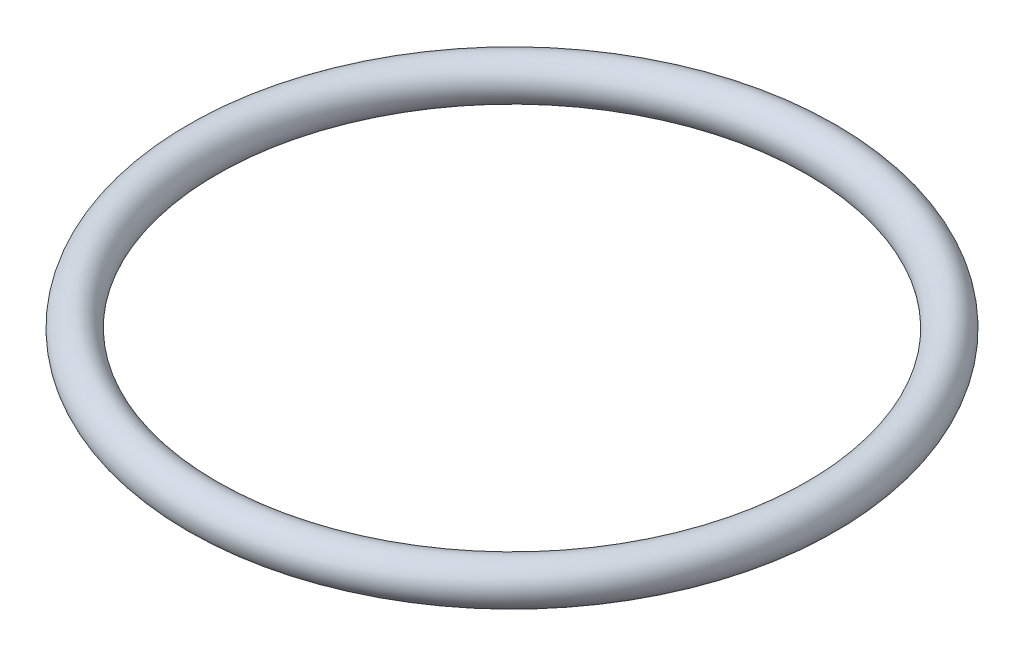
ISO-10303-21;
HEADER;
FILE_DESCRIPTION(('STEP AP214'),'2;1');
FILE_NAME('part.step','',(''),(''),'','','');
FILE_SCHEMA(('AUTOMOTIVE_DESIGN { 1 0 10303 214 1 1 1 1 }'));
ENDSEC;
DATA;
#1=APPLICATION_CONTEXT('core data for automotive mechanical design processes');
#2=APPLICATION_PROTOCOL_DEFINITION('international standard','automotive_design',2000,#1);
#3=PRODUCT_CONTEXT('',#1,'mechanical');
#4=PRODUCT('Part','Part','',(#3));
#5=PRODUCT_RELATED_PRODUCT_CATEGORY('part','',(#4));
#6=PRODUCT_DEFINITION_FORMATION('','',#4);
#7=PRODUCT_DEFINITION_CONTEXT('part definition',#1,'design');
#8=PRODUCT_DEFINITION('design','',#6,#7);
#9=PRODUCT_DEFINITION_SHAPE('','',#8);
#10=(LENGTH_UNIT() NAMED_UNIT(*) SI_UNIT(.MILLI.,.METRE.));
#11=(NAMED_UNIT(*) PLANE_ANGLE_UNIT() SI_UNIT($,.RADIAN.));
#12=(NAMED_UNIT(*) SI_UNIT($,.STERADIAN.) SOLID_ANGLE_UNIT());
#13=UNCERTAINTY_MEASURE_WITH_UNIT(LENGTH_MEASURE(1.E-05),#10,'distance_accuracy_value','');
#14=(GEOMETRIC_REPRESENTATION_CONTEXT(3) GLOBAL_UNCERTAINTY_ASSIGNED_CONTEXT((#13)) GLOBAL_UNIT_ASSIGNED_CONTEXT((#10,
#11,#12)) REPRESENTATION_CONTEXT('',''));
#15=CARTESIAN_POINT('',(0.,0.,0.));
#16=DIRECTION('',(0.,0.,1.));
#17=DIRECTION('',(1.,0.,0.));
#18=AXIS2_PLACEMENT_3D('',#15,#16,#17);
#19=CARTESIAN_POINT('',(0.,0.,0.));
#20=DIRECTION('',(0.,-1.,0.));
#21=DIRECTION('',(0.,0.,-1.));
#22=AXIS2_PLACEMENT_3D('',#19,#20,#21);
#23=TOROIDAL_SURFACE('',#22,30.5,2.);
#24=CARTESIAN_POINT('',(0.,0.,-32.5));
#25=VERTEX_POINT('',#24);
#26=VERTEX_LOOP('',#25);
#27=FACE_BOUND('',#26,.T.);
#28=ADVANCED_FACE('F35',(#27),#23,.T.);
#29=CLOSED_SHELL('',(#28));
#30=MANIFOLD_SOLID_BREP('B2',#29);
#31=ADVANCED_BREP_SHAPE_REPRESENTATION('',(#18,#30),#14);
#32=SHAPE_DEFINITION_REPRESENTATION(#9,#31);
ENDSEC;
END-ISO-10303-21;
